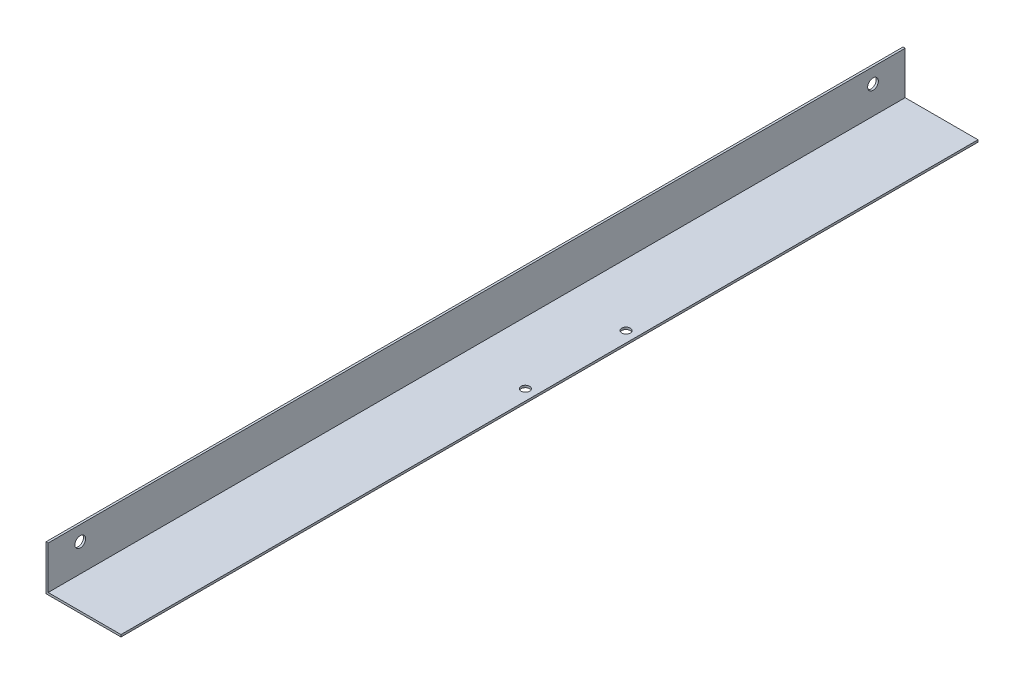
ISO-10303-21;
HEADER;
FILE_DESCRIPTION(('STEP AP214'),'2;1');
FILE_NAME('part.step','',(''),(''),'','','');
FILE_SCHEMA(('AUTOMOTIVE_DESIGN { 1 0 10303 214 1 1 1 1 }'));
ENDSEC;
DATA;
#1=APPLICATION_CONTEXT('core data for automotive mechanical design processes');
#2=APPLICATION_PROTOCOL_DEFINITION('international standard','automotive_design',2000,#1);
#3=PRODUCT_CONTEXT('',#1,'mechanical');
#4=PRODUCT('Part','Part','',(#3));
#5=PRODUCT_RELATED_PRODUCT_CATEGORY('part','',(#4));
#6=PRODUCT_DEFINITION_FORMATION('','',#4);
#7=PRODUCT_DEFINITION_CONTEXT('part definition',#1,'design');
#8=PRODUCT_DEFINITION('design','',#6,#7);
#9=PRODUCT_DEFINITION_SHAPE('','',#8);
#10=(LENGTH_UNIT() NAMED_UNIT(*) SI_UNIT(.MILLI.,.METRE.));
#11=(NAMED_UNIT(*) PLANE_ANGLE_UNIT() SI_UNIT($,.RADIAN.));
#12=(NAMED_UNIT(*) SI_UNIT($,.STERADIAN.) SOLID_ANGLE_UNIT());
#13=UNCERTAINTY_MEASURE_WITH_UNIT(LENGTH_MEASURE(1.E-05),#10,'distance_accuracy_value','');
#14=(GEOMETRIC_REPRESENTATION_CONTEXT(3) GLOBAL_UNCERTAINTY_ASSIGNED_CONTEXT((#13)) GLOBAL_UNIT_ASSIGNED_CONTEXT((#10,
#11,#12)) REPRESENTATION_CONTEXT('',''));
#15=CARTESIAN_POINT('',(0.,0.,0.));
#16=DIRECTION('',(0.,0.,1.));
#17=DIRECTION('',(1.,0.,0.));
#18=AXIS2_PLACEMENT_3D('',#15,#16,#17);
#19=CARTESIAN_POINT('',(-1.,20.,400.));
#20=DIRECTION('',(0.,-1.,0.));
#21=DIRECTION('',(0.,0.,-1.));
#22=AXIS2_PLACEMENT_3D('',#19,#20,#21);
#23=PLANE('',#22);
#24=DIRECTION('',(-1.,0.,0.));
#25=VECTOR('',#24,1.);
#26=CARTESIAN_POINT('',(-1.,20.,0.));
#27=LINE('',#26,#25);
#28=CARTESIAN_POINT('',(0.,20.,0.));
#29=VERTEX_POINT('',#28);
#30=CARTESIAN_POINT('',(-1.,20.,0.));
#31=VERTEX_POINT('',#30);
#32=EDGE_CURVE('E123',#29,#31,#27,.T.);
#33=ORIENTED_EDGE('',*,*,#32,.T.);
#34=DIRECTION('',(0.,0.,-1.));
#35=VECTOR('',#34,1.);
#36=CARTESIAN_POINT('',(-1.,20.,400.));
#37=LINE('',#36,#35);
#38=CARTESIAN_POINT('',(-1.,20.,400.));
#39=VERTEX_POINT('',#38);
#40=EDGE_CURVE('E11',#39,#31,#37,.T.);
#41=ORIENTED_EDGE('',*,*,#40,.F.);
#42=DIRECTION('',(-1.,0.,0.));
#43=VECTOR('',#42,1.);
#44=CARTESIAN_POINT('',(-1.,20.,400.));
#45=LINE('',#44,#43);
#46=CARTESIAN_POINT('',(0.,20.,400.));
#47=VERTEX_POINT('',#46);
#48=EDGE_CURVE('E134',#47,#39,#45,.T.);
#49=ORIENTED_EDGE('',*,*,#48,.F.);
#50=DIRECTION('',(0.,0.,-1.));
#51=VECTOR('',#50,1.);
#52=CARTESIAN_POINT('',(0.,20.,400.));
#53=LINE('',#52,#51);
#54=EDGE_CURVE('E119',#47,#29,#53,.T.);
#55=ORIENTED_EDGE('',*,*,#54,.T.);
#56=EDGE_LOOP('',(#33,#41,#49,#55));
#57=FACE_BOUND('',#56,.T.);
#58=ADVANCED_FACE('F37',(#57),#23,.F.);
#59=CARTESIAN_POINT('',(-1.,-1.,400.));
#60=DIRECTION('',(1.,0.,0.));
#61=DIRECTION('',(0.,1.,0.));
#62=AXIS2_PLACEMENT_3D('',#59,#60,#61);
#63=PLANE('',#62);
#64=CARTESIAN_POINT('',(-1.,13.,15.));
#65=DIRECTION('',(-1.,0.,0.));
#66=DIRECTION('',(0.,-1.,0.));
#67=AXIS2_PLACEMENT_3D('',#64,#65,#66);
#68=CIRCLE('',#67,2.5);
#69=CARTESIAN_POINT('',(-1.,10.5,15.));
#70=VERTEX_POINT('',#69);
#71=EDGE_CURVE('E141',#70,#70,#68,.T.);
#72=ORIENTED_EDGE('',*,*,#71,.F.);
#73=EDGE_LOOP('',(#72));
#74=FACE_BOUND('',#73,.T.);
#75=CARTESIAN_POINT('',(-1.,13.0000000000001,385.));
#76=DIRECTION('',(-1.,0.,0.));
#77=DIRECTION('',(0.,1.,0.));
#78=AXIS2_PLACEMENT_3D('',#75,#76,#77);
#79=CIRCLE('',#78,2.50000000000002);
#80=CARTESIAN_POINT('',(-1.,15.5000000000001,385.));
#81=VERTEX_POINT('',#80);
#82=EDGE_CURVE('E147',#81,#81,#79,.T.);
#83=ORIENTED_EDGE('',*,*,#82,.F.);
#84=EDGE_LOOP('',(#83));
#85=FACE_BOUND('',#84,.T.);
#86=DIRECTION('',(0.,-1.,0.));
#87=VECTOR('',#86,1.);
#88=CARTESIAN_POINT('',(-1.,-1.,0.));
#89=LINE('',#88,#87);
#90=CARTESIAN_POINT('',(-1.,-1.,0.));
#91=VERTEX_POINT('',#90);
#92=EDGE_CURVE('E126',#31,#91,#89,.T.);
#93=ORIENTED_EDGE('',*,*,#92,.T.);
#94=DIRECTION('',(0.,0.,-1.));
#95=VECTOR('',#94,1.);
#96=CARTESIAN_POINT('',(-1.,-1.,400.));
#97=LINE('',#96,#95);
#98=CARTESIAN_POINT('',(-1.,-1.,400.));
#99=VERTEX_POINT('',#98);
#100=EDGE_CURVE('E46',#99,#91,#97,.T.);
#101=ORIENTED_EDGE('',*,*,#100,.F.);
#102=DIRECTION('',(0.,-1.,0.));
#103=VECTOR('',#102,1.);
#104=CARTESIAN_POINT('',(-1.,-1.,400.));
#105=LINE('',#104,#103);
#106=EDGE_CURVE('E92',#39,#99,#105,.T.);
#107=ORIENTED_EDGE('',*,*,#106,.F.);
#108=ORIENTED_EDGE('',*,*,#40,.T.);
#109=EDGE_LOOP('',(#93,#101,#107,#108));
#110=FACE_BOUND('',#109,.T.);
#111=ADVANCED_FACE('F167',(#74,#85,#110),#63,.F.);
#112=CARTESIAN_POINT('',(-1.,-1.,400.));
#113=DIRECTION('',(0.,1.,0.));
#114=DIRECTION('',(0.,0.,1.));
#115=AXIS2_PLACEMENT_3D('',#112,#113,#114);
#116=PLANE('',#115);
#117=CARTESIAN_POINT('',(28.9999999999999,-1.,206.26028371565));
#118=DIRECTION('',(0.,1.,0.));
#119=DIRECTION('',(0.,0.,1.));
#120=AXIS2_PLACEMENT_3D('',#117,#118,#119);
#121=CIRCLE('',#120,2.00000000000002);
#122=CARTESIAN_POINT('',(28.9999999999999,-1.,208.26028371565));
#123=VERTEX_POINT('',#122);
#124=EDGE_CURVE('E127',#123,#123,#121,.T.);
#125=ORIENTED_EDGE('',*,*,#124,.T.);
#126=EDGE_LOOP('',(#125));
#127=FACE_BOUND('',#126,.T.);
#128=CARTESIAN_POINT('',(28.9999999999999,-1.,159.26028371565));
#129=DIRECTION('',(0.,1.,0.));
#130=DIRECTION('',(0.,0.,1.));
#131=AXIS2_PLACEMENT_3D('',#128,#129,#130);
#132=CIRCLE('',#131,2.00000000000003);
#133=CARTESIAN_POINT('',(28.9999999999999,-1.,161.26028371565));
#134=VERTEX_POINT('',#133);
#135=EDGE_CURVE('E159',#134,#134,#132,.T.);
#136=ORIENTED_EDGE('',*,*,#135,.T.);
#137=EDGE_LOOP('',(#136));
#138=FACE_BOUND('',#137,.T.);
#139=DIRECTION('',(1.,0.,0.));
#140=VECTOR('',#139,1.);
#141=CARTESIAN_POINT('',(-1.,-1.,0.));
#142=LINE('',#141,#140);
#143=CARTESIAN_POINT('',(34.,-1.,0.));
#144=VERTEX_POINT('',#143);
#145=EDGE_CURVE('E129',#91,#144,#142,.T.);
#146=ORIENTED_EDGE('',*,*,#145,.T.);
#147=DIRECTION('',(0.,0.,-1.));
#148=VECTOR('',#147,1.);
#149=CARTESIAN_POINT('',(34.,-1.,400.));
#150=LINE('',#149,#148);
#151=CARTESIAN_POINT('',(34.,-1.,400.));
#152=VERTEX_POINT('',#151);
#153=EDGE_CURVE('E114',#152,#144,#150,.T.);
#154=ORIENTED_EDGE('',*,*,#153,.F.);
#155=DIRECTION('',(1.,0.,0.));
#156=VECTOR('',#155,1.);
#157=CARTESIAN_POINT('',(-1.,-1.,400.));
#158=LINE('',#157,#156);
#159=EDGE_CURVE('E105',#99,#152,#158,.T.);
#160=ORIENTED_EDGE('',*,*,#159,.F.);
#161=ORIENTED_EDGE('',*,*,#100,.T.);
#162=EDGE_LOOP('',(#146,#154,#160,#161));
#163=FACE_BOUND('',#162,.T.);
#164=ADVANCED_FACE('F170',(#127,#138,#163),#116,.F.);
#165=CARTESIAN_POINT('',(34.,0.,400.));
#166=DIRECTION('',(-1.,0.,0.));
#167=DIRECTION('',(0.,0.,1.));
#168=AXIS2_PLACEMENT_3D('',#165,#166,#167);
#169=PLANE('',#168);
#170=DIRECTION('',(0.,1.,0.));
#171=VECTOR('',#170,1.);
#172=CARTESIAN_POINT('',(34.,0.,0.));
#173=LINE('',#172,#171);
#174=CARTESIAN_POINT('',(34.,0.,0.));
#175=VERTEX_POINT('',#174);
#176=EDGE_CURVE('E113',#144,#175,#173,.T.);
#177=ORIENTED_EDGE('',*,*,#176,.T.);
#178=DIRECTION('',(0.,0.,-1.));
#179=VECTOR('',#178,1.);
#180=CARTESIAN_POINT('',(34.,0.,400.));
#181=LINE('',#180,#179);
#182=CARTESIAN_POINT('',(34.,0.,400.));
#183=VERTEX_POINT('',#182);
#184=EDGE_CURVE('E110',#183,#175,#181,.T.);
#185=ORIENTED_EDGE('',*,*,#184,.F.);
#186=DIRECTION('',(0.,1.,0.));
#187=VECTOR('',#186,1.);
#188=CARTESIAN_POINT('',(34.,0.,400.));
#189=LINE('',#188,#187);
#190=EDGE_CURVE('E99',#152,#183,#189,.T.);
#191=ORIENTED_EDGE('',*,*,#190,.F.);
#192=ORIENTED_EDGE('',*,*,#153,.T.);
#193=EDGE_LOOP('',(#177,#185,#191,#192));
#194=FACE_BOUND('',#193,.T.);
#195=ADVANCED_FACE('F111',(#194),#169,.F.);
#196=CARTESIAN_POINT('',(0.,0.,400.));
#197=DIRECTION('',(0.,-1.,0.));
#198=DIRECTION('',(0.,0.,-1.));
#199=AXIS2_PLACEMENT_3D('',#196,#197,#198);
#200=PLANE('',#199);
#201=CARTESIAN_POINT('',(28.9999999999999,0.,206.26028371565));
#202=DIRECTION('',(0.,1.,0.));
#203=DIRECTION('',(0.,0.,1.));
#204=AXIS2_PLACEMENT_3D('',#201,#202,#203);
#205=CIRCLE('',#204,2.00000000000002);
#206=CARTESIAN_POINT('',(28.9999999999999,0.,208.26028371565));
#207=VERTEX_POINT('',#206);
#208=EDGE_CURVE('E156',#207,#207,#205,.T.);
#209=ORIENTED_EDGE('',*,*,#208,.F.);
#210=EDGE_LOOP('',(#209));
#211=FACE_BOUND('',#210,.T.);
#212=CARTESIAN_POINT('',(28.9999999999999,0.,159.26028371565));
#213=DIRECTION('',(0.,1.,0.));
#214=DIRECTION('',(0.,0.,1.));
#215=AXIS2_PLACEMENT_3D('',#212,#213,#214);
#216=CIRCLE('',#215,2.00000000000003);
#217=CARTESIAN_POINT('',(28.9999999999999,0.,161.26028371565));
#218=VERTEX_POINT('',#217);
#219=EDGE_CURVE('E145',#218,#218,#216,.T.);
#220=ORIENTED_EDGE('',*,*,#219,.F.);
#221=EDGE_LOOP('',(#220));
#222=FACE_BOUND('',#221,.T.);
#223=DIRECTION('',(-1.,0.,0.));
#224=VECTOR('',#223,1.);
#225=CARTESIAN_POINT('',(0.,0.,0.));
#226=LINE('',#225,#224);
#227=CARTESIAN_POINT('',(0.,0.,0.));
#228=VERTEX_POINT('',#227);
#229=EDGE_CURVE('E78',#175,#228,#226,.T.);
#230=ORIENTED_EDGE('',*,*,#229,.T.);
#231=DIRECTION('',(0.,0.,-1.));
#232=VECTOR('',#231,1.);
#233=CARTESIAN_POINT('',(0.,0.,400.));
#234=LINE('',#233,#232);
#235=CARTESIAN_POINT('',(0.,0.,400.));
#236=VERTEX_POINT('',#235);
#237=EDGE_CURVE('E115',#236,#228,#234,.T.);
#238=ORIENTED_EDGE('',*,*,#237,.F.);
#239=DIRECTION('',(-1.,0.,0.));
#240=VECTOR('',#239,1.);
#241=CARTESIAN_POINT('',(0.,0.,400.));
#242=LINE('',#241,#240);
#243=EDGE_CURVE('E103',#183,#236,#242,.T.);
#244=ORIENTED_EDGE('',*,*,#243,.F.);
#245=ORIENTED_EDGE('',*,*,#184,.T.);
#246=EDGE_LOOP('',(#230,#238,#244,#245));
#247=FACE_BOUND('',#246,.T.);
#248=ADVANCED_FACE('F117',(#211,#222,#247),#200,.F.);
#249=CARTESIAN_POINT('',(0.,20.,400.));
#250=DIRECTION('',(-1.,0.,0.));
#251=DIRECTION('',(0.,-1.,0.));
#252=AXIS2_PLACEMENT_3D('',#249,#250,#251);
#253=PLANE('',#252);
#254=CARTESIAN_POINT('',(0.,13.,15.));
#255=DIRECTION('',(-1.,0.,0.));
#256=DIRECTION('',(0.,-1.,0.));
#257=AXIS2_PLACEMENT_3D('',#254,#255,#256);
#258=CIRCLE('',#257,2.5);
#259=CARTESIAN_POINT('',(0.,10.5,15.));
#260=VERTEX_POINT('',#259);
#261=EDGE_CURVE('E40',#260,#260,#258,.T.);
#262=ORIENTED_EDGE('',*,*,#261,.T.);
#263=EDGE_LOOP('',(#262));
#264=FACE_BOUND('',#263,.T.);
#265=CARTESIAN_POINT('',(0.,13.0000000000001,385.));
#266=DIRECTION('',(-1.,0.,0.));
#267=DIRECTION('',(0.,-1.,0.));
#268=AXIS2_PLACEMENT_3D('',#265,#266,#267);
#269=CIRCLE('',#268,2.50000000000002);
#270=CARTESIAN_POINT('',(0.,10.5,385.));
#271=VERTEX_POINT('',#270);
#272=EDGE_CURVE('E139',#271,#271,#269,.T.);
#273=ORIENTED_EDGE('',*,*,#272,.T.);
#274=EDGE_LOOP('',(#273));
#275=FACE_BOUND('',#274,.T.);
#276=DIRECTION('',(0.,1.,0.));
#277=VECTOR('',#276,1.);
#278=CARTESIAN_POINT('',(0.,20.,0.));
#279=LINE('',#278,#277);
#280=EDGE_CURVE('E84',#228,#29,#279,.T.);
#281=ORIENTED_EDGE('',*,*,#280,.T.);
#282=ORIENTED_EDGE('',*,*,#54,.F.);
#283=DIRECTION('',(0.,1.,0.));
#284=VECTOR('',#283,1.);
#285=CARTESIAN_POINT('',(0.,20.,400.));
#286=LINE('',#285,#284);
#287=EDGE_CURVE('E55',#236,#47,#286,.T.);
#288=ORIENTED_EDGE('',*,*,#287,.F.);
#289=ORIENTED_EDGE('',*,*,#237,.T.);
#290=EDGE_LOOP('',(#281,#282,#288,#289));
#291=FACE_BOUND('',#290,.T.);
#292=ADVANCED_FACE('F175',(#264,#275,#291),#253,.F.);
#293=CARTESIAN_POINT('',(0.,0.,400.));
#294=DIRECTION('',(0.,0.,-1.));
#295=DIRECTION('',(-1.,0.,0.));
#296=AXIS2_PLACEMENT_3D('',#293,#294,#295);
#297=PLANE('',#296);
#298=ORIENTED_EDGE('',*,*,#48,.T.);
#299=ORIENTED_EDGE('',*,*,#106,.T.);
#300=ORIENTED_EDGE('',*,*,#159,.T.);
#301=ORIENTED_EDGE('',*,*,#190,.T.);
#302=ORIENTED_EDGE('',*,*,#243,.T.);
#303=ORIENTED_EDGE('',*,*,#287,.T.);
#304=EDGE_LOOP('',(#298,#299,#300,#301,#302,#303));
#305=FACE_BOUND('',#304,.T.);
#306=ADVANCED_FACE('F101',(#305),#297,.F.);
#307=CARTESIAN_POINT('',(0.,0.,0.));
#308=DIRECTION('',(0.,0.,-1.));
#309=DIRECTION('',(-1.,0.,0.));
#310=AXIS2_PLACEMENT_3D('',#307,#308,#309);
#311=PLANE('',#310);
#312=ORIENTED_EDGE('',*,*,#32,.F.);
#313=ORIENTED_EDGE('',*,*,#280,.F.);
#314=ORIENTED_EDGE('',*,*,#229,.F.);
#315=ORIENTED_EDGE('',*,*,#176,.F.);
#316=ORIENTED_EDGE('',*,*,#145,.F.);
#317=ORIENTED_EDGE('',*,*,#92,.F.);
#318=EDGE_LOOP('',(#312,#313,#314,#315,#316,#317));
#319=FACE_BOUND('',#318,.T.);
#320=ADVANCED_FACE('F173',(#319),#311,.T.);
#321=CARTESIAN_POINT('',(28.9999999999999,-1.,159.26028371565));
#322=DIRECTION('',(0.,1.,0.));
#323=DIRECTION('',(0.,0.,1.));
#324=AXIS2_PLACEMENT_3D('',#321,#322,#323);
#325=CYLINDRICAL_SURFACE('',#324,2.00000000000003);
#326=ORIENTED_EDGE('',*,*,#135,.F.);
#327=EDGE_LOOP('',(#326));
#328=FACE_BOUND('',#327,.T.);
#329=ORIENTED_EDGE('',*,*,#219,.T.);
#330=EDGE_LOOP('',(#329));
#331=FACE_BOUND('',#330,.T.);
#332=ADVANCED_FACE('F218',(#328,#331),#325,.F.);
#333=CARTESIAN_POINT('',(28.9999999999999,-1.,206.26028371565));
#334=DIRECTION('',(0.,1.,0.));
#335=DIRECTION('',(0.,0.,1.));
#336=AXIS2_PLACEMENT_3D('',#333,#334,#335);
#337=CYLINDRICAL_SURFACE('',#336,2.00000000000002);
#338=ORIENTED_EDGE('',*,*,#124,.F.);
#339=EDGE_LOOP('',(#338));
#340=FACE_BOUND('',#339,.T.);
#341=ORIENTED_EDGE('',*,*,#208,.T.);
#342=EDGE_LOOP('',(#341));
#343=FACE_BOUND('',#342,.T.);
#344=ADVANCED_FACE('F223',(#340,#343),#337,.F.);
#345=CARTESIAN_POINT('',(9.,13.0000000000001,385.));
#346=DIRECTION('',(-1.,0.,0.));
#347=DIRECTION('',(0.,-1.,0.));
#348=AXIS2_PLACEMENT_3D('',#345,#346,#347);
#349=CYLINDRICAL_SURFACE('',#348,2.50000000000002);
#350=ORIENTED_EDGE('',*,*,#82,.T.);
#351=EDGE_LOOP('',(#350));
#352=FACE_BOUND('',#351,.T.);
#353=ORIENTED_EDGE('',*,*,#272,.F.);
#354=EDGE_LOOP('',(#353));
#355=FACE_BOUND('',#354,.T.);
#356=ADVANCED_FACE('F234',(#352,#355),#349,.F.);
#357=CARTESIAN_POINT('',(9.,13.,15.));
#358=DIRECTION('',(-1.,0.,0.));
#359=DIRECTION('',(0.,-1.,0.));
#360=AXIS2_PLACEMENT_3D('',#357,#358,#359);
#361=CYLINDRICAL_SURFACE('',#360,2.5);
#362=ORIENTED_EDGE('',*,*,#71,.T.);
#363=EDGE_LOOP('',(#362));
#364=FACE_BOUND('',#363,.T.);
#365=ORIENTED_EDGE('',*,*,#261,.F.);
#366=EDGE_LOOP('',(#365));
#367=FACE_BOUND('',#366,.T.);
#368=ADVANCED_FACE('F254',(#364,#367),#361,.F.);
#369=CLOSED_SHELL('',(#58,#111,#164,#195,#248,#292,#306,#320,#332,#344,#356,#368));
#370=MANIFOLD_SOLID_BREP('B2',#369);
#371=ADVANCED_BREP_SHAPE_REPRESENTATION('',(#18,#370),#14);
#372=SHAPE_DEFINITION_REPRESENTATION(#9,#371);
ENDSEC;
END-ISO-10303-21;
